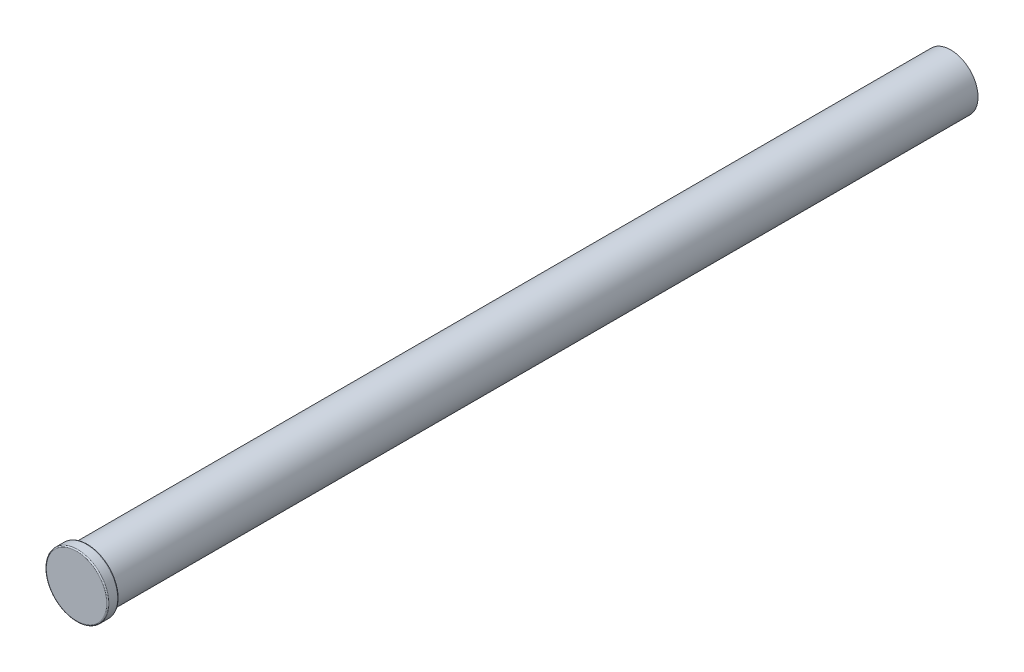
ISO-10303-21;
HEADER;
FILE_DESCRIPTION(('STEP AP214'),'2;1');
FILE_NAME('part.step','',(''),(''),'','','');
FILE_SCHEMA(('AUTOMOTIVE_DESIGN { 1 0 10303 214 1 1 1 1 }'));
ENDSEC;
DATA;
#1=APPLICATION_CONTEXT('core data for automotive mechanical design processes');
#2=APPLICATION_PROTOCOL_DEFINITION('international standard','automotive_design',2000,#1);
#3=PRODUCT_CONTEXT('',#1,'mechanical');
#4=PRODUCT('Part','Part','',(#3));
#5=PRODUCT_RELATED_PRODUCT_CATEGORY('part','',(#4));
#6=PRODUCT_DEFINITION_FORMATION('','',#4);
#7=PRODUCT_DEFINITION_CONTEXT('part definition',#1,'design');
#8=PRODUCT_DEFINITION('design','',#6,#7);
#9=PRODUCT_DEFINITION_SHAPE('','',#8);
#10=(LENGTH_UNIT() NAMED_UNIT(*) SI_UNIT(.MILLI.,.METRE.));
#11=(NAMED_UNIT(*) PLANE_ANGLE_UNIT() SI_UNIT($,.RADIAN.));
#12=(NAMED_UNIT(*) SI_UNIT($,.STERADIAN.) SOLID_ANGLE_UNIT());
#13=UNCERTAINTY_MEASURE_WITH_UNIT(LENGTH_MEASURE(1.E-05),#10,'distance_accuracy_value','');
#14=(GEOMETRIC_REPRESENTATION_CONTEXT(3) GLOBAL_UNCERTAINTY_ASSIGNED_CONTEXT((#13)) GLOBAL_UNIT_ASSIGNED_CONTEXT((#10,
#11,#12)) REPRESENTATION_CONTEXT('',''));
#15=CARTESIAN_POINT('',(0.,0.,0.));
#16=DIRECTION('',(0.,0.,1.));
#17=DIRECTION('',(1.,0.,0.));
#18=AXIS2_PLACEMENT_3D('',#15,#16,#17);
#19=CARTESIAN_POINT('',(0.,0.,112.));
#20=DIRECTION('',(0.,0.,-1.));
#21=DIRECTION('',(-1.,0.,0.));
#22=AXIS2_PLACEMENT_3D('',#19,#20,#21);
#23=CYLINDRICAL_SURFACE('',#22,2.5);
#24=CARTESIAN_POINT('',(0.,0.,78.9));
#25=DIRECTION('',(0.,0.,1.));
#26=DIRECTION('',(1.,0.,0.));
#27=AXIS2_PLACEMENT_3D('',#24,#25,#26);
#28=CIRCLE('',#27,2.5);
#29=CARTESIAN_POINT('',(2.5,0.,78.9));
#30=VERTEX_POINT('',#29);
#31=EDGE_CURVE('E57',#30,#30,#28,.F.);
#32=ORIENTED_EDGE('',*,*,#31,.T.);
#33=EDGE_LOOP('',(#32));
#34=FACE_BOUND('',#33,.T.);
#35=CARTESIAN_POINT('',(0.,0.,0.));
#36=DIRECTION('',(0.,0.,-1.));
#37=DIRECTION('',(-1.,0.,0.));
#38=AXIS2_PLACEMENT_3D('',#35,#36,#37);
#39=CIRCLE('',#38,2.5);
#40=CARTESIAN_POINT('',(-2.5,0.,0.));
#41=VERTEX_POINT('',#40);
#42=EDGE_CURVE('E64',#41,#41,#39,.T.);
#43=ORIENTED_EDGE('',*,*,#42,.F.);
#44=EDGE_LOOP('',(#43));
#45=FACE_BOUND('',#44,.T.);
#46=ADVANCED_FACE('F34',(#34,#45),#23,.T.);
#47=CARTESIAN_POINT('',(0.,0.,0.));
#48=DIRECTION('',(0.,0.,1.));
#49=DIRECTION('',(1.,0.,0.));
#50=AXIS2_PLACEMENT_3D('',#47,#48,#49);
#51=PLANE('',#50);
#52=CARTESIAN_POINT('',(0.,0.,0.));
#53=DIRECTION('',(0.,0.,-1.));
#54=DIRECTION('',(-1.,0.,0.));
#55=AXIS2_PLACEMENT_3D('',#52,#53,#54);
#56=CIRCLE('',#55,2.);
#57=CARTESIAN_POINT('',(-2.,0.,0.));
#58=VERTEX_POINT('',#57);
#59=EDGE_CURVE('E61',#58,#58,#56,.T.);
#60=ORIENTED_EDGE('',*,*,#59,.F.);
#61=EDGE_LOOP('',(#60));
#62=FACE_BOUND('',#61,.T.);
#63=ORIENTED_EDGE('',*,*,#42,.T.);
#64=EDGE_LOOP('',(#63));
#65=FACE_BOUND('',#64,.T.);
#66=ADVANCED_FACE('F70',(#62,#65),#51,.F.);
#67=CARTESIAN_POINT('',(0.,0.,15.));
#68=DIRECTION('',(0.,0.,-1.));
#69=DIRECTION('',(-1.,0.,0.));
#70=AXIS2_PLACEMENT_3D('',#67,#68,#69);
#71=CYLINDRICAL_SURFACE('',#70,2.);
#72=CARTESIAN_POINT('',(0.,0.,15.));
#73=DIRECTION('',(0.,0.,-1.));
#74=DIRECTION('',(-1.,0.,0.));
#75=AXIS2_PLACEMENT_3D('',#72,#73,#74);
#76=CIRCLE('',#75,2.);
#77=CARTESIAN_POINT('',(-2.,0.,15.));
#78=VERTEX_POINT('',#77);
#79=EDGE_CURVE('E60',#78,#78,#76,.T.);
#80=ORIENTED_EDGE('',*,*,#79,.F.);
#81=EDGE_LOOP('',(#80));
#82=FACE_BOUND('',#81,.T.);
#83=ORIENTED_EDGE('',*,*,#59,.T.);
#84=EDGE_LOOP('',(#83));
#85=FACE_BOUND('',#84,.T.);
#86=ADVANCED_FACE('F78',(#82,#85),#71,.F.);
#87=CARTESIAN_POINT('',(0.,0.,15.));
#88=DIRECTION('',(0.,0.,-1.));
#89=DIRECTION('',(-1.,0.,0.));
#90=AXIS2_PLACEMENT_3D('',#87,#88,#89);
#91=PLANE('',#90);
#92=ORIENTED_EDGE('',*,*,#79,.T.);
#93=EDGE_LOOP('',(#92));
#94=FACE_BOUND('',#93,.T.);
#95=ADVANCED_FACE('F85',(#94),#91,.T.);
#96=CARTESIAN_POINT('',(0.,0.,79.));
#97=DIRECTION('',(0.,0.,1.));
#98=DIRECTION('',(1.,0.,0.));
#99=AXIS2_PLACEMENT_3D('',#96,#97,#98);
#100=CYLINDRICAL_SURFACE('',#99,2.86034933954503);
#101=CARTESIAN_POINT('',(0.,0.,79.9));
#102=DIRECTION('',(0.,0.,1.));
#103=DIRECTION('',(1.,0.,0.));
#104=AXIS2_PLACEMENT_3D('',#101,#102,#103);
#105=CIRCLE('',#104,2.86034933954503);
#106=CARTESIAN_POINT('',(2.86034933954503,0.,79.9));
#107=VERTEX_POINT('',#106);
#108=EDGE_CURVE('E10',#107,#107,#105,.F.);
#109=ORIENTED_EDGE('',*,*,#108,.T.);
#110=EDGE_LOOP('',(#109));
#111=FACE_BOUND('',#110,.T.);
#112=CARTESIAN_POINT('',(0.,0.,79.1));
#113=DIRECTION('',(0.,0.,1.));
#114=DIRECTION('',(1.,0.,0.));
#115=AXIS2_PLACEMENT_3D('',#112,#113,#114);
#116=CIRCLE('',#115,2.86034933954503);
#117=CARTESIAN_POINT('',(2.86034933954503,0.,79.1));
#118=VERTEX_POINT('',#117);
#119=EDGE_CURVE('E41',#118,#118,#116,.T.);
#120=ORIENTED_EDGE('',*,*,#119,.T.);
#121=EDGE_LOOP('',(#120));
#122=FACE_BOUND('',#121,.T.);
#123=ADVANCED_FACE('F83',(#111,#122),#100,.T.);
#124=CARTESIAN_POINT('',(0.,0.,79.));
#125=DIRECTION('',(0.,0.,1.));
#126=DIRECTION('',(1.,0.,0.));
#127=AXIS2_PLACEMENT_3D('',#124,#125,#126);
#128=PLANE('',#127);
#129=CARTESIAN_POINT('',(0.,0.,79.));
#130=DIRECTION('',(0.,0.,1.));
#131=DIRECTION('',(1.,0.,0.));
#132=AXIS2_PLACEMENT_3D('',#129,#130,#131);
#133=CIRCLE('',#132,2.6);
#134=CARTESIAN_POINT('',(2.6,0.,79.));
#135=VERTEX_POINT('',#134);
#136=EDGE_CURVE('E49',#135,#135,#133,.T.);
#137=ORIENTED_EDGE('',*,*,#136,.T.);
#138=EDGE_LOOP('',(#137));
#139=FACE_BOUND('',#138,.T.);
#140=CARTESIAN_POINT('',(0.,0.,79.));
#141=DIRECTION('',(0.,0.,1.));
#142=DIRECTION('',(1.,0.,0.));
#143=AXIS2_PLACEMENT_3D('',#140,#141,#142);
#144=CIRCLE('',#143,2.76034933954503);
#145=CARTESIAN_POINT('',(2.76034933954503,0.,79.));
#146=VERTEX_POINT('',#145);
#147=EDGE_CURVE('E54',#146,#146,#144,.F.);
#148=ORIENTED_EDGE('',*,*,#147,.T.);
#149=EDGE_LOOP('',(#148));
#150=FACE_BOUND('',#149,.T.);
#151=ADVANCED_FACE('F95',(#139,#150),#128,.F.);
#152=CARTESIAN_POINT('',(0.,0.,80.));
#153=DIRECTION('',(0.,0.,1.));
#154=DIRECTION('',(1.,0.,0.));
#155=AXIS2_PLACEMENT_3D('',#152,#153,#154);
#156=PLANE('',#155);
#157=CARTESIAN_POINT('',(0.,0.,80.));
#158=DIRECTION('',(0.,0.,1.));
#159=DIRECTION('',(1.,0.,0.));
#160=AXIS2_PLACEMENT_3D('',#157,#158,#159);
#161=CIRCLE('',#160,2.76034933954503);
#162=CARTESIAN_POINT('',(2.76034933954503,0.,80.));
#163=VERTEX_POINT('',#162);
#164=EDGE_CURVE('E45',#163,#163,#161,.T.);
#165=ORIENTED_EDGE('',*,*,#164,.T.);
#166=EDGE_LOOP('',(#165));
#167=FACE_BOUND('',#166,.T.);
#168=ADVANCED_FACE('F92',(#167),#156,.T.);
#169=CARTESIAN_POINT('',(0.,0.,78.9));
#170=DIRECTION('',(0.,0.,1.));
#171=DIRECTION('',(1.,0.,0.));
#172=AXIS2_PLACEMENT_3D('',#169,#170,#171);
#173=TOROIDAL_SURFACE('',#172,2.6,0.1);
#174=ORIENTED_EDGE('',*,*,#136,.F.);
#175=EDGE_LOOP('',(#174));
#176=FACE_BOUND('',#175,.T.);
#177=ORIENTED_EDGE('',*,*,#31,.F.);
#178=EDGE_LOOP('',(#177));
#179=FACE_BOUND('',#178,.T.);
#180=ADVANCED_FACE('F94',(#176,#179),#173,.F.);
#181=CARTESIAN_POINT('',(0.,0.,79.9));
#182=DIRECTION('',(0.,0.,1.));
#183=DIRECTION('',(1.,0.,0.));
#184=AXIS2_PLACEMENT_3D('',#181,#182,#183);
#185=TOROIDAL_SURFACE('',#184,2.76034933954503,0.1);
#186=ORIENTED_EDGE('',*,*,#108,.F.);
#187=EDGE_LOOP('',(#186));
#188=FACE_BOUND('',#187,.T.);
#189=ORIENTED_EDGE('',*,*,#164,.F.);
#190=EDGE_LOOP('',(#189));
#191=FACE_BOUND('',#190,.T.);
#192=ADVANCED_FACE('F99',(#188,#191),#185,.T.);
#193=CARTESIAN_POINT('',(0.,0.,79.1));
#194=DIRECTION('',(0.,0.,1.));
#195=DIRECTION('',(1.,0.,0.));
#196=AXIS2_PLACEMENT_3D('',#193,#194,#195);
#197=TOROIDAL_SURFACE('',#196,2.76034933954503,0.1);
#198=ORIENTED_EDGE('',*,*,#147,.F.);
#199=EDGE_LOOP('',(#198));
#200=FACE_BOUND('',#199,.T.);
#201=ORIENTED_EDGE('',*,*,#119,.F.);
#202=EDGE_LOOP('',(#201));
#203=FACE_BOUND('',#202,.T.);
#204=ADVANCED_FACE('F36',(#200,#203),#197,.T.);
#205=CLOSED_SHELL('',(#46,#66,#86,#95,#123,#151,#168,#180,#192,#204));
#206=MANIFOLD_SOLID_BREP('B2',#205);
#207=ADVANCED_BREP_SHAPE_REPRESENTATION('',(#18,#206),#14);
#208=SHAPE_DEFINITION_REPRESENTATION(#9,#207);
ENDSEC;
END-ISO-10303-21;
